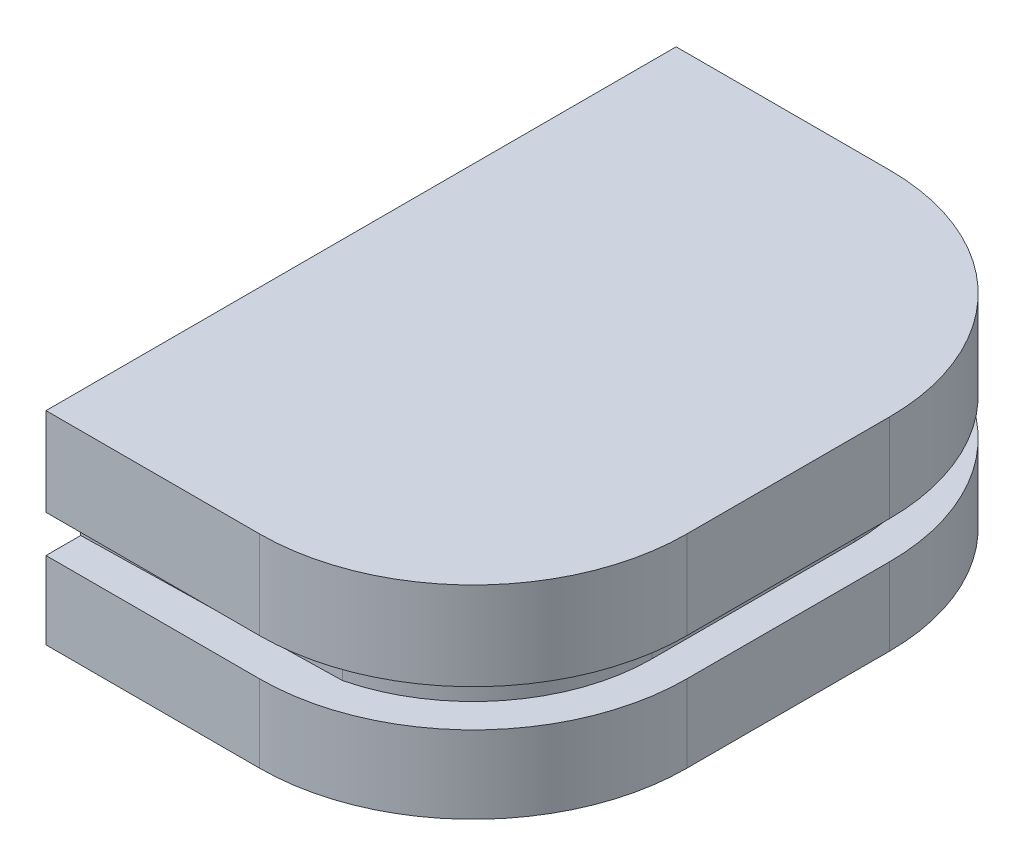
ISO-10303-21;
HEADER;
FILE_DESCRIPTION(('STEP AP214'),'2;1');
FILE_NAME('part.step','',(''),(''),'','','');
FILE_SCHEMA(('AUTOMOTIVE_DESIGN { 1 0 10303 214 1 1 1 1 }'));
ENDSEC;
DATA;
#1=APPLICATION_CONTEXT('core data for automotive mechanical design processes');
#2=APPLICATION_PROTOCOL_DEFINITION('international standard','automotive_design',2000,#1);
#3=PRODUCT_CONTEXT('',#1,'mechanical');
#4=PRODUCT('Part','Part','',(#3));
#5=PRODUCT_RELATED_PRODUCT_CATEGORY('part','',(#4));
#6=PRODUCT_DEFINITION_FORMATION('','',#4);
#7=PRODUCT_DEFINITION_CONTEXT('part definition',#1,'design');
#8=PRODUCT_DEFINITION('design','',#6,#7);
#9=PRODUCT_DEFINITION_SHAPE('','',#8);
#10=(LENGTH_UNIT() NAMED_UNIT(*) SI_UNIT(.MILLI.,.METRE.));
#11=(NAMED_UNIT(*) PLANE_ANGLE_UNIT() SI_UNIT($,.RADIAN.));
#12=(NAMED_UNIT(*) SI_UNIT($,.STERADIAN.) SOLID_ANGLE_UNIT());
#13=UNCERTAINTY_MEASURE_WITH_UNIT(LENGTH_MEASURE(1.E-05),#10,'distance_accuracy_value','');
#14=(GEOMETRIC_REPRESENTATION_CONTEXT(3) GLOBAL_UNCERTAINTY_ASSIGNED_CONTEXT((#13)) GLOBAL_UNIT_ASSIGNED_CONTEXT((#10,
#11,#12)) REPRESENTATION_CONTEXT('',''));
#15=CARTESIAN_POINT('',(0.,0.,0.));
#16=DIRECTION('',(0.,0.,1.));
#17=DIRECTION('',(1.,0.,0.));
#18=AXIS2_PLACEMENT_3D('',#15,#16,#17);
#19=CARTESIAN_POINT('',(0.,3.8,0.));
#20=DIRECTION('',(1.,0.,0.));
#21=DIRECTION('',(0.,0.,-1.));
#22=AXIS2_PLACEMENT_3D('',#19,#20,#21);
#23=PLANE('',#22);
#24=DIRECTION('',(0.,0.,1.));
#25=VECTOR('',#24,1.);
#26=CARTESIAN_POINT('',(0.,1.45,-11.8));
#27=LINE('',#26,#25);
#28=CARTESIAN_POINT('',(0.,1.45,-11.8));
#29=VERTEX_POINT('',#28);
#30=CARTESIAN_POINT('',(0.,1.45,-11.0257231267003));
#31=VERTEX_POINT('',#30);
#32=EDGE_CURVE('E337',#29,#31,#27,.T.);
#33=ORIENTED_EDGE('',*,*,#32,.F.);
#34=DIRECTION('',(0.,-1.,0.));
#35=VECTOR('',#34,1.);
#36=CARTESIAN_POINT('',(0.,3.8,-11.8));
#37=LINE('',#36,#35);
#38=CARTESIAN_POINT('',(0.,0.,-11.8));
#39=VERTEX_POINT('',#38);
#40=EDGE_CURVE('E203',#29,#39,#37,.T.);
#41=ORIENTED_EDGE('',*,*,#40,.T.);
#42=DIRECTION('',(0.,0.,1.));
#43=VECTOR('',#42,1.);
#44=CARTESIAN_POINT('',(0.,0.,0.));
#45=LINE('',#44,#43);
#46=CARTESIAN_POINT('',(0.,0.,0.));
#47=VERTEX_POINT('',#46);
#48=EDGE_CURVE('E188',#39,#47,#45,.T.);
#49=ORIENTED_EDGE('',*,*,#48,.T.);
#50=DIRECTION('',(0.,-1.,0.));
#51=VECTOR('',#50,1.);
#52=CARTESIAN_POINT('',(0.,3.8,0.));
#53=LINE('',#52,#51);
#54=CARTESIAN_POINT('',(0.,1.45,0.));
#55=VERTEX_POINT('',#54);
#56=EDGE_CURVE('E183',#55,#47,#53,.T.);
#57=ORIENTED_EDGE('',*,*,#56,.F.);
#58=DIRECTION('',(0.,0.,1.));
#59=VECTOR('',#58,1.);
#60=CARTESIAN_POINT('',(0.,1.45,-0.65));
#61=LINE('',#60,#59);
#62=CARTESIAN_POINT('',(0.,1.45,-0.65));
#63=VERTEX_POINT('',#62);
#64=EDGE_CURVE('E166',#63,#55,#61,.T.);
#65=ORIENTED_EDGE('',*,*,#64,.F.);
#66=DIRECTION('',(0.,1.,0.));
#67=VECTOR('',#66,1.);
#68=CARTESIAN_POINT('',(0.,1.45,-0.65));
#69=LINE('',#68,#67);
#70=CARTESIAN_POINT('',(0.,2.15,-0.65));
#71=VERTEX_POINT('',#70);
#72=EDGE_CURVE('E193',#63,#71,#69,.T.);
#73=ORIENTED_EDGE('',*,*,#72,.T.);
#74=DIRECTION('',(0.,0.,1.));
#75=VECTOR('',#74,1.);
#76=CARTESIAN_POINT('',(0.,2.15,-0.65));
#77=LINE('',#76,#75);
#78=CARTESIAN_POINT('',(0.,2.15,0.));
#79=VERTEX_POINT('',#78);
#80=EDGE_CURVE('E169',#71,#79,#77,.T.);
#81=ORIENTED_EDGE('',*,*,#80,.T.);
#82=CARTESIAN_POINT('',(0.,3.8,0.));
#83=VERTEX_POINT('',#82);
#84=EDGE_CURVE('E204',#83,#79,#53,.T.);
#85=ORIENTED_EDGE('',*,*,#84,.F.);
#86=DIRECTION('',(0.,0.,1.));
#87=VECTOR('',#86,1.);
#88=CARTESIAN_POINT('',(0.,3.8,0.));
#89=LINE('',#88,#87);
#90=CARTESIAN_POINT('',(0.,3.8,-11.8));
#91=VERTEX_POINT('',#90);
#92=EDGE_CURVE('E199',#91,#83,#89,.T.);
#93=ORIENTED_EDGE('',*,*,#92,.F.);
#94=CARTESIAN_POINT('',(0.,2.15,-11.8));
#95=VERTEX_POINT('',#94);
#96=EDGE_CURVE('E200',#91,#95,#37,.T.);
#97=ORIENTED_EDGE('',*,*,#96,.T.);
#98=DIRECTION('',(0.,0.,1.));
#99=VECTOR('',#98,1.);
#100=CARTESIAN_POINT('',(0.,2.15,-11.8));
#101=LINE('',#100,#99);
#102=CARTESIAN_POINT('',(0.,2.15,-11.0257231267003));
#103=VERTEX_POINT('',#102);
#104=EDGE_CURVE('E246',#95,#103,#101,.T.);
#105=ORIENTED_EDGE('',*,*,#104,.T.);
#106=DIRECTION('',(0.,1.,0.));
#107=VECTOR('',#106,1.);
#108=CARTESIAN_POINT('',(0.,1.45,-11.0257231267003));
#109=LINE('',#108,#107);
#110=EDGE_CURVE('E280',#31,#103,#109,.T.);
#111=ORIENTED_EDGE('',*,*,#110,.F.);
#112=EDGE_LOOP('',(#33,#41,#49,#57,#65,#73,#81,#85,#93,#97,#105,#111));
#113=FACE_BOUND('',#112,.T.);
#114=ADVANCED_FACE('F35',(#113),#23,.F.);
#115=CARTESIAN_POINT('',(0.,3.8,0.));
#116=DIRECTION('',(0.,0.,-1.));
#117=DIRECTION('',(-1.,0.,0.));
#118=AXIS2_PLACEMENT_3D('',#115,#116,#117);
#119=PLANE('',#118);
#120=DIRECTION('',(1.,0.,0.));
#121=VECTOR('',#120,1.);
#122=CARTESIAN_POINT('',(0.,1.45,0.));
#123=LINE('',#122,#121);
#124=CARTESIAN_POINT('',(4.,1.45,0.));
#125=VERTEX_POINT('',#124);
#126=EDGE_CURVE('E159',#55,#125,#123,.T.);
#127=ORIENTED_EDGE('',*,*,#126,.F.);
#128=ORIENTED_EDGE('',*,*,#56,.T.);
#129=DIRECTION('',(1.,0.,0.));
#130=VECTOR('',#129,1.);
#131=CARTESIAN_POINT('',(0.,0.,0.));
#132=LINE('',#131,#130);
#133=CARTESIAN_POINT('',(4.,0.,0.));
#134=VERTEX_POINT('',#133);
#135=EDGE_CURVE('E182',#47,#134,#132,.T.);
#136=ORIENTED_EDGE('',*,*,#135,.T.);
#137=DIRECTION('',(0.,-1.,0.));
#138=VECTOR('',#137,1.);
#139=CARTESIAN_POINT('',(4.,3.8,0.));
#140=LINE('',#139,#138);
#141=EDGE_CURVE('E11',#134,#125,#140,.F.);
#142=ORIENTED_EDGE('',*,*,#141,.T.);
#143=EDGE_LOOP('',(#127,#128,#136,#142));
#144=FACE_BOUND('',#143,.T.);
#145=ADVANCED_FACE('F180',(#144),#119,.F.);
#146=CARTESIAN_POINT('',(8.,3.8,0.));
#147=DIRECTION('',(-1.,0.,0.));
#148=DIRECTION('',(0.,0.,1.));
#149=AXIS2_PLACEMENT_3D('',#146,#147,#148);
#150=PLANE('',#149);
#151=DIRECTION('',(0.,0.,-1.));
#152=VECTOR('',#151,1.);
#153=CARTESIAN_POINT('',(8.,1.45,-4.));
#154=LINE('',#153,#152);
#155=CARTESIAN_POINT('',(8.,1.45,-4.));
#156=VERTEX_POINT('',#155);
#157=CARTESIAN_POINT('',(8.,1.45,-7.8));
#158=VERTEX_POINT('',#157);
#159=EDGE_CURVE('E177',#156,#158,#154,.T.);
#160=ORIENTED_EDGE('',*,*,#159,.F.);
#161=DIRECTION('',(0.,-1.,0.));
#162=VECTOR('',#161,1.);
#163=CARTESIAN_POINT('',(8.,3.8,-4.));
#164=LINE('',#163,#162);
#165=CARTESIAN_POINT('',(8.,0.,-4.));
#166=VERTEX_POINT('',#165);
#167=EDGE_CURVE('E176',#156,#166,#164,.T.);
#168=ORIENTED_EDGE('',*,*,#167,.T.);
#169=DIRECTION('',(0.,0.,-1.));
#170=VECTOR('',#169,1.);
#171=CARTESIAN_POINT('',(8.,0.,0.));
#172=LINE('',#171,#170);
#173=CARTESIAN_POINT('',(8.,0.,-7.8));
#174=VERTEX_POINT('',#173);
#175=EDGE_CURVE('E187',#166,#174,#172,.T.);
#176=ORIENTED_EDGE('',*,*,#175,.T.);
#177=DIRECTION('',(0.,-1.,0.));
#178=VECTOR('',#177,1.);
#179=CARTESIAN_POINT('',(8.,3.8,-7.8));
#180=LINE('',#179,#178);
#181=EDGE_CURVE('E219',#174,#158,#180,.F.);
#182=ORIENTED_EDGE('',*,*,#181,.T.);
#183=EDGE_LOOP('',(#160,#168,#176,#182));
#184=FACE_BOUND('',#183,.T.);
#185=ADVANCED_FACE('F294',(#184),#150,.F.);
#186=CARTESIAN_POINT('',(0.,3.8,-11.8));
#187=DIRECTION('',(0.,0.,1.));
#188=DIRECTION('',(1.,0.,0.));
#189=AXIS2_PLACEMENT_3D('',#186,#187,#188);
#190=PLANE('',#189);
#191=DIRECTION('',(-1.,0.,0.));
#192=VECTOR('',#191,1.);
#193=CARTESIAN_POINT('',(4.,1.45,-11.8));
#194=LINE('',#193,#192);
#195=CARTESIAN_POINT('',(4.,1.45,-11.8));
#196=VERTEX_POINT('',#195);
#197=EDGE_CURVE('E335',#196,#29,#194,.T.);
#198=ORIENTED_EDGE('',*,*,#197,.F.);
#199=DIRECTION('',(0.,-1.,0.));
#200=VECTOR('',#199,1.);
#201=CARTESIAN_POINT('',(4.,3.8,-11.8));
#202=LINE('',#201,#200);
#203=CARTESIAN_POINT('',(4.,0.,-11.8));
#204=VERTEX_POINT('',#203);
#205=EDGE_CURVE('E207',#196,#204,#202,.T.);
#206=ORIENTED_EDGE('',*,*,#205,.T.);
#207=DIRECTION('',(-1.,0.,0.));
#208=VECTOR('',#207,1.);
#209=CARTESIAN_POINT('',(0.,0.,-11.8));
#210=LINE('',#209,#208);
#211=EDGE_CURVE('E191',#204,#39,#210,.T.);
#212=ORIENTED_EDGE('',*,*,#211,.T.);
#213=ORIENTED_EDGE('',*,*,#40,.F.);
#214=EDGE_LOOP('',(#198,#206,#212,#213));
#215=FACE_BOUND('',#214,.T.);
#216=ADVANCED_FACE('F300',(#215),#190,.F.);
#217=CARTESIAN_POINT('',(4.,3.8,-7.8));
#218=DIRECTION('',(0.,-1.,0.));
#219=DIRECTION('',(0.,0.,-1.));
#220=AXIS2_PLACEMENT_3D('',#217,#218,#219);
#221=CYLINDRICAL_SURFACE('',#220,4.);
#222=ORIENTED_EDGE('',*,*,#205,.F.);
#223=CARTESIAN_POINT('',(4.,1.45,-7.8));
#224=DIRECTION('',(0.,1.,0.));
#225=DIRECTION('',(0.,0.,1.));
#226=AXIS2_PLACEMENT_3D('',#223,#224,#225);
#227=CIRCLE('',#226,4.);
#228=EDGE_CURVE('E331',#158,#196,#227,.T.);
#229=ORIENTED_EDGE('',*,*,#228,.F.);
#230=ORIENTED_EDGE('',*,*,#181,.F.);
#231=CARTESIAN_POINT('',(4.,0.,-7.8));
#232=DIRECTION('',(0.,-1.,0.));
#233=DIRECTION('',(0.,0.,-1.));
#234=AXIS2_PLACEMENT_3D('',#231,#232,#233);
#235=CIRCLE('',#234,4.);
#236=EDGE_CURVE('E213',#204,#174,#235,.T.);
#237=ORIENTED_EDGE('',*,*,#236,.F.);
#238=EDGE_LOOP('',(#222,#229,#230,#237));
#239=FACE_BOUND('',#238,.T.);
#240=ADVANCED_FACE('F313',(#239),#221,.T.);
#241=CARTESIAN_POINT('',(4.,3.8,-4.));
#242=DIRECTION('',(0.,-1.,0.));
#243=DIRECTION('',(0.,0.,-1.));
#244=AXIS2_PLACEMENT_3D('',#241,#242,#243);
#245=CYLINDRICAL_SURFACE('',#244,4.);
#246=ORIENTED_EDGE('',*,*,#167,.F.);
#247=CARTESIAN_POINT('',(4.,1.45,-4.));
#248=DIRECTION('',(0.,1.,0.));
#249=DIRECTION('',(0.,0.,1.));
#250=AXIS2_PLACEMENT_3D('',#247,#248,#249);
#251=CIRCLE('',#250,4.);
#252=EDGE_CURVE('E162',#125,#156,#251,.T.);
#253=ORIENTED_EDGE('',*,*,#252,.F.);
#254=ORIENTED_EDGE('',*,*,#141,.F.);
#255=CARTESIAN_POINT('',(4.,0.,-4.));
#256=DIRECTION('',(0.,-1.,0.));
#257=DIRECTION('',(0.,0.,-1.));
#258=AXIS2_PLACEMENT_3D('',#255,#256,#257);
#259=CIRCLE('',#258,4.);
#260=EDGE_CURVE('E211',#166,#134,#259,.T.);
#261=ORIENTED_EDGE('',*,*,#260,.F.);
#262=EDGE_LOOP('',(#246,#253,#254,#261));
#263=FACE_BOUND('',#262,.T.);
#264=ADVANCED_FACE('F174',(#263),#245,.T.);
#265=ORIENTED_EDGE('',*,*,#84,.T.);
#266=DIRECTION('',(1.,0.,0.));
#267=VECTOR('',#266,1.);
#268=CARTESIAN_POINT('',(0.,2.15,0.));
#269=LINE('',#268,#267);
#270=CARTESIAN_POINT('',(4.,2.15,0.));
#271=VERTEX_POINT('',#270);
#272=EDGE_CURVE('E358',#79,#271,#269,.T.);
#273=ORIENTED_EDGE('',*,*,#272,.T.);
#274=CARTESIAN_POINT('',(4.,3.8,0.));
#275=VERTEX_POINT('',#274);
#276=EDGE_CURVE('E43',#271,#275,#140,.F.);
#277=ORIENTED_EDGE('',*,*,#276,.T.);
#278=DIRECTION('',(1.,0.,0.));
#279=VECTOR('',#278,1.);
#280=CARTESIAN_POINT('',(0.,3.8,0.));
#281=LINE('',#280,#279);
#282=EDGE_CURVE('E283',#83,#275,#281,.T.);
#283=ORIENTED_EDGE('',*,*,#282,.F.);
#284=EDGE_LOOP('',(#265,#273,#277,#283));
#285=FACE_BOUND('',#284,.T.);
#286=ADVANCED_FACE('F292',(#285),#119,.F.);
#287=CARTESIAN_POINT('',(8.,3.8,-4.));
#288=VERTEX_POINT('',#287);
#289=CARTESIAN_POINT('',(8.,2.15,-4.));
#290=VERTEX_POINT('',#289);
#291=EDGE_CURVE('E215',#288,#290,#164,.T.);
#292=ORIENTED_EDGE('',*,*,#291,.T.);
#293=DIRECTION('',(0.,0.,-1.));
#294=VECTOR('',#293,1.);
#295=CARTESIAN_POINT('',(8.,2.15,-4.));
#296=LINE('',#295,#294);
#297=CARTESIAN_POINT('',(8.,2.15,-7.8));
#298=VERTEX_POINT('',#297);
#299=EDGE_CURVE('E50',#290,#298,#296,.T.);
#300=ORIENTED_EDGE('',*,*,#299,.T.);
#301=CARTESIAN_POINT('',(8.,3.8,-7.8));
#302=VERTEX_POINT('',#301);
#303=EDGE_CURVE('E218',#298,#302,#180,.F.);
#304=ORIENTED_EDGE('',*,*,#303,.T.);
#305=DIRECTION('',(0.,0.,-1.));
#306=VECTOR('',#305,1.);
#307=CARTESIAN_POINT('',(8.,3.8,0.));
#308=LINE('',#307,#306);
#309=EDGE_CURVE('E233',#288,#302,#308,.T.);
#310=ORIENTED_EDGE('',*,*,#309,.F.);
#311=EDGE_LOOP('',(#292,#300,#304,#310));
#312=FACE_BOUND('',#311,.T.);
#313=ADVANCED_FACE('F290',(#312),#150,.F.);
#314=CARTESIAN_POINT('',(4.,3.8,-11.8));
#315=VERTEX_POINT('',#314);
#316=CARTESIAN_POINT('',(4.,2.15,-11.8));
#317=VERTEX_POINT('',#316);
#318=EDGE_CURVE('E208',#315,#317,#202,.T.);
#319=ORIENTED_EDGE('',*,*,#318,.T.);
#320=DIRECTION('',(-1.,0.,0.));
#321=VECTOR('',#320,1.);
#322=CARTESIAN_POINT('',(4.,2.15,-11.8));
#323=LINE('',#322,#321);
#324=EDGE_CURVE('E244',#317,#95,#323,.T.);
#325=ORIENTED_EDGE('',*,*,#324,.T.);
#326=ORIENTED_EDGE('',*,*,#96,.F.);
#327=DIRECTION('',(-1.,0.,0.));
#328=VECTOR('',#327,1.);
#329=CARTESIAN_POINT('',(0.,3.8,-11.8));
#330=LINE('',#329,#328);
#331=EDGE_CURVE('E230',#315,#91,#330,.T.);
#332=ORIENTED_EDGE('',*,*,#331,.F.);
#333=EDGE_LOOP('',(#319,#325,#326,#332));
#334=FACE_BOUND('',#333,.T.);
#335=ADVANCED_FACE('F238',(#334),#190,.F.);
#336=CARTESIAN_POINT('',(0.,3.8,0.));
#337=DIRECTION('',(0.,-1.,0.));
#338=DIRECTION('',(0.,0.,-1.));
#339=AXIS2_PLACEMENT_3D('',#336,#337,#338);
#340=PLANE('',#339);
#341=ORIENTED_EDGE('',*,*,#309,.T.);
#342=CARTESIAN_POINT('',(4.,3.8,-7.8));
#343=DIRECTION('',(0.,-1.,0.));
#344=DIRECTION('',(0.,0.,-1.));
#345=AXIS2_PLACEMENT_3D('',#342,#343,#344);
#346=CIRCLE('',#345,4.);
#347=EDGE_CURVE('E223',#302,#315,#346,.F.);
#348=ORIENTED_EDGE('',*,*,#347,.T.);
#349=ORIENTED_EDGE('',*,*,#331,.T.);
#350=ORIENTED_EDGE('',*,*,#92,.T.);
#351=ORIENTED_EDGE('',*,*,#282,.T.);
#352=CARTESIAN_POINT('',(4.,3.8,-4.));
#353=DIRECTION('',(0.,-1.,0.));
#354=DIRECTION('',(0.,0.,-1.));
#355=AXIS2_PLACEMENT_3D('',#352,#353,#354);
#356=CIRCLE('',#355,4.);
#357=EDGE_CURVE('E222',#275,#288,#356,.F.);
#358=ORIENTED_EDGE('',*,*,#357,.T.);
#359=EDGE_LOOP('',(#341,#348,#349,#350,#351,#358));
#360=FACE_BOUND('',#359,.T.);
#361=ADVANCED_FACE('F228',(#360),#340,.F.);
#362=CARTESIAN_POINT('',(0.,0.,0.));
#363=DIRECTION('',(0.,-1.,0.));
#364=DIRECTION('',(0.,0.,-1.));
#365=AXIS2_PLACEMENT_3D('',#362,#363,#364);
#366=PLANE('',#365);
#367=ORIENTED_EDGE('',*,*,#211,.F.);
#368=ORIENTED_EDGE('',*,*,#236,.T.);
#369=ORIENTED_EDGE('',*,*,#175,.F.);
#370=ORIENTED_EDGE('',*,*,#260,.T.);
#371=ORIENTED_EDGE('',*,*,#135,.F.);
#372=ORIENTED_EDGE('',*,*,#48,.F.);
#373=EDGE_LOOP('',(#367,#368,#369,#370,#371,#372));
#374=FACE_BOUND('',#373,.T.);
#375=ADVANCED_FACE('F312',(#374),#366,.T.);
#376=CARTESIAN_POINT('',(4.,2.15,-7.8));
#377=DIRECTION('',(0.,1.,0.));
#378=DIRECTION('',(0.,0.,1.));
#379=AXIS2_PLACEMENT_3D('',#376,#377,#378);
#380=CIRCLE('',#379,4.);
#381=EDGE_CURVE('E243',#298,#317,#380,.T.);
#382=ORIENTED_EDGE('',*,*,#381,.T.);
#383=ORIENTED_EDGE('',*,*,#318,.F.);
#384=ORIENTED_EDGE('',*,*,#347,.F.);
#385=ORIENTED_EDGE('',*,*,#303,.F.);
#386=EDGE_LOOP('',(#382,#383,#384,#385));
#387=FACE_BOUND('',#386,.T.);
#388=ADVANCED_FACE('F242',(#387),#221,.T.);
#389=CARTESIAN_POINT('',(4.,2.15,-4.));
#390=DIRECTION('',(0.,1.,0.));
#391=DIRECTION('',(0.,0.,1.));
#392=AXIS2_PLACEMENT_3D('',#389,#390,#391);
#393=CIRCLE('',#392,4.);
#394=EDGE_CURVE('E248',#271,#290,#393,.T.);
#395=ORIENTED_EDGE('',*,*,#394,.T.);
#396=ORIENTED_EDGE('',*,*,#291,.F.);
#397=ORIENTED_EDGE('',*,*,#357,.F.);
#398=ORIENTED_EDGE('',*,*,#276,.F.);
#399=EDGE_LOOP('',(#395,#396,#397,#398));
#400=FACE_BOUND('',#399,.T.);
#401=ADVANCED_FACE('F37',(#400),#245,.T.);
#402=CARTESIAN_POINT('',(4.80279129344359,1.45,-0.747612240342309));
#403=DIRECTION('',(-0.020319868259129,0.,-0.999793530162069));
#404=DIRECTION('',(-0.999793530162069,0.,0.020319868259129));
#405=AXIS2_PLACEMENT_3D('',#402,#403,#404);
#406=PLANE('',#405);
#407=DIRECTION('',(-0.999793530162069,0.,0.020319868259129));
#408=VECTOR('',#407,1.);
#409=CARTESIAN_POINT('',(4.80279129344359,2.15,-0.747612240342309));
#410=LINE('',#409,#408);
#411=CARTESIAN_POINT('',(4.80279129344359,2.15,-0.747612240342309));
#412=VERTEX_POINT('',#411);
#413=EDGE_CURVE('E266',#412,#71,#410,.T.);
#414=ORIENTED_EDGE('',*,*,#413,.T.);
#415=ORIENTED_EDGE('',*,*,#72,.F.);
#416=DIRECTION('',(-0.999793530162069,0.,0.020319868259129));
#417=VECTOR('',#416,1.);
#418=CARTESIAN_POINT('',(4.80279129344359,1.45,-0.747612240342309));
#419=LINE('',#418,#417);
#420=CARTESIAN_POINT('',(4.80279129344359,1.45,-0.747612240342309));
#421=VERTEX_POINT('',#420);
#422=EDGE_CURVE('E355',#421,#63,#419,.T.);
#423=ORIENTED_EDGE('',*,*,#422,.F.);
#424=DIRECTION('',(0.,1.,0.));
#425=VECTOR('',#424,1.);
#426=CARTESIAN_POINT('',(4.80279129344359,1.45,-0.747612240342309));
#427=LINE('',#426,#425);
#428=EDGE_CURVE('E272',#421,#412,#427,.T.);
#429=ORIENTED_EDGE('',*,*,#428,.T.);
#430=EDGE_LOOP('',(#414,#415,#423,#429));
#431=FACE_BOUND('',#430,.T.);
#432=ADVANCED_FACE('F318',(#431),#406,.F.);
#433=CARTESIAN_POINT('',(4.,1.45,-4.));
#434=DIRECTION('',(0.,1.,0.));
#435=DIRECTION('',(0.,0.,1.));
#436=AXIS2_PLACEMENT_3D('',#433,#434,#435);
#437=CYLINDRICAL_SURFACE('',#436,3.35);
#438=CARTESIAN_POINT('',(4.,2.15,-4.));
#439=DIRECTION('',(0.,-1.,0.));
#440=DIRECTION('',(0.,0.,-1.));
#441=AXIS2_PLACEMENT_3D('',#438,#439,#440);
#442=CIRCLE('',#441,3.35);
#443=CARTESIAN_POINT('',(7.35,2.15,-4.));
#444=VERTEX_POINT('',#443);
#445=EDGE_CURVE('E263',#444,#412,#442,.T.);
#446=ORIENTED_EDGE('',*,*,#445,.T.);
#447=ORIENTED_EDGE('',*,*,#428,.F.);
#448=CARTESIAN_POINT('',(4.,1.45,-4.));
#449=DIRECTION('',(0.,-1.,0.));
#450=DIRECTION('',(0.,0.,-1.));
#451=AXIS2_PLACEMENT_3D('',#448,#449,#450);
#452=CIRCLE('',#451,3.35);
#453=CARTESIAN_POINT('',(7.35,1.45,-4.));
#454=VERTEX_POINT('',#453);
#455=EDGE_CURVE('E352',#454,#421,#452,.T.);
#456=ORIENTED_EDGE('',*,*,#455,.F.);
#457=DIRECTION('',(0.,1.,0.));
#458=VECTOR('',#457,1.);
#459=CARTESIAN_POINT('',(7.35,1.45,-4.));
#460=LINE('',#459,#458);
#461=EDGE_CURVE('E274',#454,#444,#460,.T.);
#462=ORIENTED_EDGE('',*,*,#461,.T.);
#463=EDGE_LOOP('',(#446,#447,#456,#462));
#464=FACE_BOUND('',#463,.T.);
#465=ADVANCED_FACE('F367',(#464),#437,.T.);
#466=CARTESIAN_POINT('',(7.35,1.45,-7.8));
#467=DIRECTION('',(-1.,0.,0.));
#468=DIRECTION('',(0.,0.,1.));
#469=AXIS2_PLACEMENT_3D('',#466,#467,#468);
#470=PLANE('',#469);
#471=DIRECTION('',(0.,0.,1.));
#472=VECTOR('',#471,1.);
#473=CARTESIAN_POINT('',(7.35,2.15,-7.8));
#474=LINE('',#473,#472);
#475=CARTESIAN_POINT('',(7.35,2.15,-7.8));
#476=VERTEX_POINT('',#475);
#477=EDGE_CURVE('E260',#476,#444,#474,.T.);
#478=ORIENTED_EDGE('',*,*,#477,.T.);
#479=ORIENTED_EDGE('',*,*,#461,.F.);
#480=DIRECTION('',(0.,0.,1.));
#481=VECTOR('',#480,1.);
#482=CARTESIAN_POINT('',(7.35,1.45,-7.8));
#483=LINE('',#482,#481);
#484=CARTESIAN_POINT('',(7.35,1.45,-7.8));
#485=VERTEX_POINT('',#484);
#486=EDGE_CURVE('E349',#485,#454,#483,.T.);
#487=ORIENTED_EDGE('',*,*,#486,.F.);
#488=DIRECTION('',(0.,1.,0.));
#489=VECTOR('',#488,1.);
#490=CARTESIAN_POINT('',(7.35,1.45,-7.8));
#491=LINE('',#490,#489);
#492=EDGE_CURVE('E276',#485,#476,#491,.T.);
#493=ORIENTED_EDGE('',*,*,#492,.T.);
#494=EDGE_LOOP('',(#478,#479,#487,#493));
#495=FACE_BOUND('',#494,.T.);
#496=ADVANCED_FACE('F372',(#495),#470,.F.);
#497=CARTESIAN_POINT('',(4.,1.45,-7.8));
#498=DIRECTION('',(0.,1.,0.));
#499=DIRECTION('',(0.,0.,1.));
#500=AXIS2_PLACEMENT_3D('',#497,#498,#499);
#501=CYLINDRICAL_SURFACE('',#500,3.35);
#502=CARTESIAN_POINT('',(4.,2.15,-7.8));
#503=DIRECTION('',(0.,-1.,0.));
#504=DIRECTION('',(0.,0.,-1.));
#505=AXIS2_PLACEMENT_3D('',#502,#503,#504);
#506=CIRCLE('',#505,3.35);
#507=CARTESIAN_POINT('',(4.90399685279907,2.15,-11.0257231267003));
#508=VERTEX_POINT('',#507);
#509=EDGE_CURVE('E257',#508,#476,#506,.T.);
#510=ORIENTED_EDGE('',*,*,#509,.T.);
#511=ORIENTED_EDGE('',*,*,#492,.F.);
#512=CARTESIAN_POINT('',(4.,1.45,-7.8));
#513=DIRECTION('',(0.,-1.,0.));
#514=DIRECTION('',(0.,0.,-1.));
#515=AXIS2_PLACEMENT_3D('',#512,#513,#514);
#516=CIRCLE('',#515,3.35);
#517=CARTESIAN_POINT('',(4.90399685279907,1.45,-11.0257231267003));
#518=VERTEX_POINT('',#517);
#519=EDGE_CURVE('E346',#518,#485,#516,.T.);
#520=ORIENTED_EDGE('',*,*,#519,.F.);
#521=DIRECTION('',(0.,1.,0.));
#522=VECTOR('',#521,1.);
#523=CARTESIAN_POINT('',(4.90399685279907,1.45,-11.0257231267003));
#524=LINE('',#523,#522);
#525=EDGE_CURVE('E278',#518,#508,#524,.T.);
#526=ORIENTED_EDGE('',*,*,#525,.T.);
#527=EDGE_LOOP('',(#510,#511,#520,#526));
#528=FACE_BOUND('',#527,.T.);
#529=ADVANCED_FACE('F375',(#528),#501,.T.);
#530=CARTESIAN_POINT('',(0.,1.45,-11.0257231267003));
#531=DIRECTION('',(0.,0.,1.));
#532=DIRECTION('',(1.,0.,0.));
#533=AXIS2_PLACEMENT_3D('',#530,#531,#532);
#534=PLANE('',#533);
#535=DIRECTION('',(1.,0.,0.));
#536=VECTOR('',#535,1.);
#537=CARTESIAN_POINT('',(0.,2.15,-11.0257231267003));
#538=LINE('',#537,#536);
#539=EDGE_CURVE('E254',#103,#508,#538,.T.);
#540=ORIENTED_EDGE('',*,*,#539,.T.);
#541=ORIENTED_EDGE('',*,*,#525,.F.);
#542=DIRECTION('',(1.,0.,0.));
#543=VECTOR('',#542,1.);
#544=CARTESIAN_POINT('',(0.,1.45,-11.0257231267003));
#545=LINE('',#544,#543);
#546=EDGE_CURVE('E339',#31,#518,#545,.T.);
#547=ORIENTED_EDGE('',*,*,#546,.F.);
#548=ORIENTED_EDGE('',*,*,#110,.T.);
#549=EDGE_LOOP('',(#540,#541,#547,#548));
#550=FACE_BOUND('',#549,.T.);
#551=ADVANCED_FACE('F378',(#550),#534,.F.);
#552=CARTESIAN_POINT('',(4.,1.45,-4.));
#553=DIRECTION('',(0.,1.,0.));
#554=DIRECTION('',(0.,0.,1.));
#555=AXIS2_PLACEMENT_3D('',#552,#553,#554);
#556=PLANE('',#555);
#557=ORIENTED_EDGE('',*,*,#126,.T.);
#558=ORIENTED_EDGE('',*,*,#252,.T.);
#559=ORIENTED_EDGE('',*,*,#159,.T.);
#560=ORIENTED_EDGE('',*,*,#228,.T.);
#561=ORIENTED_EDGE('',*,*,#197,.T.);
#562=ORIENTED_EDGE('',*,*,#32,.T.);
#563=ORIENTED_EDGE('',*,*,#546,.T.);
#564=ORIENTED_EDGE('',*,*,#519,.T.);
#565=ORIENTED_EDGE('',*,*,#486,.T.);
#566=ORIENTED_EDGE('',*,*,#455,.T.);
#567=ORIENTED_EDGE('',*,*,#422,.T.);
#568=ORIENTED_EDGE('',*,*,#64,.T.);
#569=EDGE_LOOP('',(#557,#558,#559,#560,#561,#562,#563,#564,#565,#566,#567,#568));
#570=FACE_BOUND('',#569,.T.);
#571=ADVANCED_FACE('F161',(#570),#556,.T.);
#572=CARTESIAN_POINT('',(4.,2.15,-4.));
#573=DIRECTION('',(0.,1.,0.));
#574=DIRECTION('',(0.,0.,1.));
#575=AXIS2_PLACEMENT_3D('',#572,#573,#574);
#576=PLANE('',#575);
#577=ORIENTED_EDGE('',*,*,#272,.F.);
#578=ORIENTED_EDGE('',*,*,#80,.F.);
#579=ORIENTED_EDGE('',*,*,#413,.F.);
#580=ORIENTED_EDGE('',*,*,#445,.F.);
#581=ORIENTED_EDGE('',*,*,#477,.F.);
#582=ORIENTED_EDGE('',*,*,#509,.F.);
#583=ORIENTED_EDGE('',*,*,#539,.F.);
#584=ORIENTED_EDGE('',*,*,#104,.F.);
#585=ORIENTED_EDGE('',*,*,#324,.F.);
#586=ORIENTED_EDGE('',*,*,#381,.F.);
#587=ORIENTED_EDGE('',*,*,#299,.F.);
#588=ORIENTED_EDGE('',*,*,#394,.F.);
#589=EDGE_LOOP('',(#577,#578,#579,#580,#581,#582,#583,#584,#585,#586,#587,#588));
#590=FACE_BOUND('',#589,.T.);
#591=ADVANCED_FACE('F360',(#590),#576,.F.);
#592=CLOSED_SHELL('',(#114,#145,#185,#216,#240,#264,#286,#313,#335,#361,#375,#388,#401,#432,
#465,#496,#529,#551,#571,#591));
#593=MANIFOLD_SOLID_BREP('B2',#592);
#594=ADVANCED_BREP_SHAPE_REPRESENTATION('',(#18,#593),#14);
#595=SHAPE_DEFINITION_REPRESENTATION(#9,#594);
ENDSEC;
END-ISO-10303-21;
